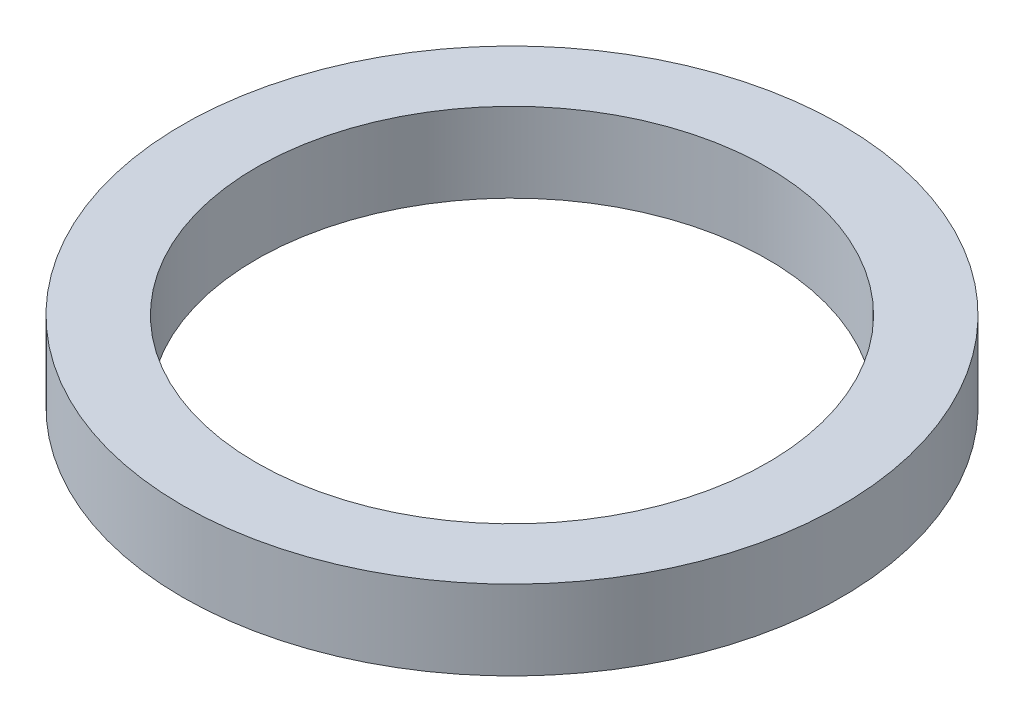
ISO-10303-21;
HEADER;
FILE_DESCRIPTION(('STEP AP214'),'2;1');
FILE_NAME('part.step','',(''),(''),'','','');
FILE_SCHEMA(('AUTOMOTIVE_DESIGN { 1 0 10303 214 1 1 1 1 }'));
ENDSEC;
DATA;
#1=APPLICATION_CONTEXT('core data for automotive mechanical design processes');
#2=APPLICATION_PROTOCOL_DEFINITION('international standard','automotive_design',2000,#1);
#3=PRODUCT_CONTEXT('',#1,'mechanical');
#4=PRODUCT('Part','Part','',(#3));
#5=PRODUCT_RELATED_PRODUCT_CATEGORY('part','',(#4));
#6=PRODUCT_DEFINITION_FORMATION('','',#4);
#7=PRODUCT_DEFINITION_CONTEXT('part definition',#1,'design');
#8=PRODUCT_DEFINITION('design','',#6,#7);
#9=PRODUCT_DEFINITION_SHAPE('','',#8);
#10=(LENGTH_UNIT() NAMED_UNIT(*) SI_UNIT(.MILLI.,.METRE.));
#11=(NAMED_UNIT(*) PLANE_ANGLE_UNIT() SI_UNIT($,.RADIAN.));
#12=(NAMED_UNIT(*) SI_UNIT($,.STERADIAN.) SOLID_ANGLE_UNIT());
#13=UNCERTAINTY_MEASURE_WITH_UNIT(LENGTH_MEASURE(1.E-05),#10,'distance_accuracy_value','');
#14=(GEOMETRIC_REPRESENTATION_CONTEXT(3) GLOBAL_UNCERTAINTY_ASSIGNED_CONTEXT((#13)) GLOBAL_UNIT_ASSIGNED_CONTEXT((#10,
#11,#12)) REPRESENTATION_CONTEXT('',''));
#15=CARTESIAN_POINT('',(0.,0.,0.));
#16=DIRECTION('',(0.,0.,1.));
#17=DIRECTION('',(1.,0.,0.));
#18=AXIS2_PLACEMENT_3D('',#15,#16,#17);
#19=CARTESIAN_POINT('',(0.,3.5,0.));
#20=DIRECTION('',(0.,1.,0.));
#21=DIRECTION('',(0.,0.,1.));
#22=AXIS2_PLACEMENT_3D('',#19,#20,#21);
#23=PLANE('',#22);
#24=CARTESIAN_POINT('',(0.,3.5,0.));
#25=DIRECTION('',(0.,1.,0.));
#26=DIRECTION('',(0.,0.,1.));
#27=AXIS2_PLACEMENT_3D('',#24,#25,#26);
#28=CIRCLE('',#27,29.);
#29=CARTESIAN_POINT('',(0.,3.5,29.));
#30=VERTEX_POINT('',#29);
#31=EDGE_CURVE('E10',#30,#30,#28,.T.);
#32=ORIENTED_EDGE('',*,*,#31,.T.);
#33=EDGE_LOOP('',(#32));
#34=FACE_BOUND('',#33,.T.);
#35=CARTESIAN_POINT('',(0.,3.5,0.));
#36=DIRECTION('',(0.,1.,0.));
#37=DIRECTION('',(0.,0.,1.));
#38=AXIS2_PLACEMENT_3D('',#35,#36,#37);
#39=CIRCLE('',#38,22.5);
#40=CARTESIAN_POINT('',(0.,3.5,22.5));
#41=VERTEX_POINT('',#40);
#42=EDGE_CURVE('E42',#41,#41,#39,.T.);
#43=ORIENTED_EDGE('',*,*,#42,.F.);
#44=EDGE_LOOP('',(#43));
#45=FACE_BOUND('',#44,.T.);
#46=ADVANCED_FACE('F31',(#34,#45),#23,.T.);
#47=CARTESIAN_POINT('',(0.,-3.5,0.));
#48=DIRECTION('',(0.,1.,0.));
#49=DIRECTION('',(0.,0.,1.));
#50=AXIS2_PLACEMENT_3D('',#47,#48,#49);
#51=PLANE('',#50);
#52=CARTESIAN_POINT('',(0.,-3.5,0.));
#53=DIRECTION('',(0.,1.,0.));
#54=DIRECTION('',(0.,0.,1.));
#55=AXIS2_PLACEMENT_3D('',#52,#53,#54);
#56=CIRCLE('',#55,29.);
#57=CARTESIAN_POINT('',(0.,-3.5,29.));
#58=VERTEX_POINT('',#57);
#59=EDGE_CURVE('E35',#58,#58,#56,.T.);
#60=ORIENTED_EDGE('',*,*,#59,.F.);
#61=EDGE_LOOP('',(#60));
#62=FACE_BOUND('',#61,.T.);
#63=CARTESIAN_POINT('',(0.,-3.5,0.));
#64=DIRECTION('',(0.,1.,0.));
#65=DIRECTION('',(0.,0.,1.));
#66=AXIS2_PLACEMENT_3D('',#63,#64,#65);
#67=CIRCLE('',#66,22.5);
#68=CARTESIAN_POINT('',(0.,-3.5,22.5));
#69=VERTEX_POINT('',#68);
#70=EDGE_CURVE('E44',#69,#69,#67,.T.);
#71=ORIENTED_EDGE('',*,*,#70,.T.);
#72=EDGE_LOOP('',(#71));
#73=FACE_BOUND('',#72,.T.);
#74=ADVANCED_FACE('F54',(#62,#73),#51,.F.);
#75=CARTESIAN_POINT('',(0.,3.5,0.));
#76=DIRECTION('',(0.,-1.,0.));
#77=DIRECTION('',(0.,0.,-1.));
#78=AXIS2_PLACEMENT_3D('',#75,#76,#77);
#79=CYLINDRICAL_SURFACE('',#78,29.);
#80=ORIENTED_EDGE('',*,*,#31,.F.);
#81=EDGE_LOOP('',(#80));
#82=FACE_BOUND('',#81,.T.);
#83=ORIENTED_EDGE('',*,*,#59,.T.);
#84=EDGE_LOOP('',(#83));
#85=FACE_BOUND('',#84,.T.);
#86=ADVANCED_FACE('F33',(#82,#85),#79,.T.);
#87=CARTESIAN_POINT('',(0.,3.5,0.));
#88=DIRECTION('',(0.,-1.,0.));
#89=DIRECTION('',(0.,0.,-1.));
#90=AXIS2_PLACEMENT_3D('',#87,#88,#89);
#91=CYLINDRICAL_SURFACE('',#90,22.5);
#92=ORIENTED_EDGE('',*,*,#42,.T.);
#93=EDGE_LOOP('',(#92));
#94=FACE_BOUND('',#93,.T.);
#95=ORIENTED_EDGE('',*,*,#70,.F.);
#96=EDGE_LOOP('',(#95));
#97=FACE_BOUND('',#96,.T.);
#98=ADVANCED_FACE('F50',(#94,#97),#91,.F.);
#99=CLOSED_SHELL('',(#46,#74,#86,#98));
#100=MANIFOLD_SOLID_BREP('B2',#99);
#101=ADVANCED_BREP_SHAPE_REPRESENTATION('',(#18,#100),#14);
#102=SHAPE_DEFINITION_REPRESENTATION(#9,#101);
ENDSEC;
END-ISO-10303-21;
